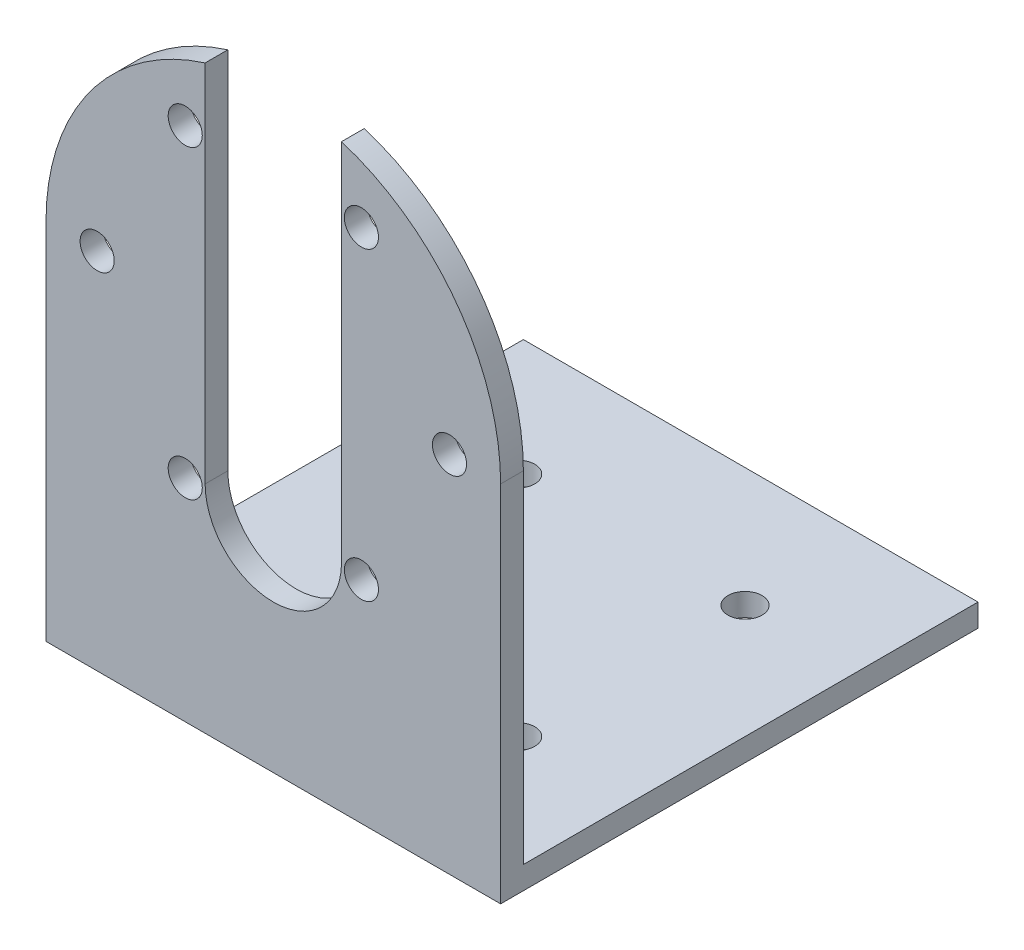
ISO-10303-21;
HEADER;
FILE_DESCRIPTION(('STEP AP214'),'2;1');
FILE_NAME('part.step','',(''),(''),'','','');
FILE_SCHEMA(('AUTOMOTIVE_DESIGN { 1 0 10303 214 1 1 1 1 }'));
ENDSEC;
DATA;
#1=APPLICATION_CONTEXT('core data for automotive mechanical design processes');
#2=APPLICATION_PROTOCOL_DEFINITION('international standard','automotive_design',2000,#1);
#3=PRODUCT_CONTEXT('',#1,'mechanical');
#4=PRODUCT('Part','Part','',(#3));
#5=PRODUCT_RELATED_PRODUCT_CATEGORY('part','',(#4));
#6=PRODUCT_DEFINITION_FORMATION('','',#4);
#7=PRODUCT_DEFINITION_CONTEXT('part definition',#1,'design');
#8=PRODUCT_DEFINITION('design','',#6,#7);
#9=PRODUCT_DEFINITION_SHAPE('','',#8);
#10=(LENGTH_UNIT() NAMED_UNIT(*) SI_UNIT(.MILLI.,.METRE.));
#11=(NAMED_UNIT(*) PLANE_ANGLE_UNIT() SI_UNIT($,.RADIAN.));
#12=(NAMED_UNIT(*) SI_UNIT($,.STERADIAN.) SOLID_ANGLE_UNIT());
#13=UNCERTAINTY_MEASURE_WITH_UNIT(LENGTH_MEASURE(1.E-05),#10,'distance_accuracy_value','');
#14=(GEOMETRIC_REPRESENTATION_CONTEXT(3) GLOBAL_UNCERTAINTY_ASSIGNED_CONTEXT((#13)) GLOBAL_UNIT_ASSIGNED_CONTEXT((#10,
#11,#12)) REPRESENTATION_CONTEXT('',''));
#15=CARTESIAN_POINT('',(0.,0.,0.));
#16=DIRECTION('',(0.,0.,1.));
#17=DIRECTION('',(1.,0.,0.));
#18=AXIS2_PLACEMENT_3D('',#15,#16,#17);
#19=CARTESIAN_POINT('',(0.,2.,0.));
#20=DIRECTION('',(0.,1.,0.));
#21=DIRECTION('',(0.,0.,1.));
#22=AXIS2_PLACEMENT_3D('',#19,#20,#21);
#23=PLANE('',#22);
#24=CARTESIAN_POINT('',(10.,2.,9.5));
#25=DIRECTION('',(0.,1.,0.));
#26=DIRECTION('',(0.,0.,1.));
#27=AXIS2_PLACEMENT_3D('',#24,#25,#26);
#28=CIRCLE('',#27,1.5);
#29=CARTESIAN_POINT('',(10.,2.,11.));
#30=VERTEX_POINT('',#29);
#31=EDGE_CURVE('E581',#30,#30,#28,.F.);
#32=ORIENTED_EDGE('',*,*,#31,.T.);
#33=EDGE_LOOP('',(#32));
#34=FACE_BOUND('',#33,.T.);
#35=CARTESIAN_POINT('',(-10.,2.,9.5));
#36=DIRECTION('',(0.,1.,0.));
#37=DIRECTION('',(0.,0.,1.));
#38=AXIS2_PLACEMENT_3D('',#35,#36,#37);
#39=CIRCLE('',#38,1.49999999999999);
#40=CARTESIAN_POINT('',(-10.,2.,11.));
#41=VERTEX_POINT('',#40);
#42=EDGE_CURVE('E578',#41,#41,#39,.F.);
#43=ORIENTED_EDGE('',*,*,#42,.T.);
#44=EDGE_LOOP('',(#43));
#45=FACE_BOUND('',#44,.T.);
#46=DIRECTION('',(-1.,0.,0.));
#47=VECTOR('',#46,1.);
#48=CARTESIAN_POINT('',(-20.,2.,19.));
#49=LINE('',#48,#47);
#50=CARTESIAN_POINT('',(20.,2.,19.));
#51=VERTEX_POINT('',#50);
#52=CARTESIAN_POINT('',(-20.,2.,19.));
#53=VERTEX_POINT('',#52);
#54=EDGE_CURVE('E196',#51,#53,#49,.T.);
#55=ORIENTED_EDGE('',*,*,#54,.F.);
#56=DIRECTION('',(0.,0.,-1.));
#57=VECTOR('',#56,1.);
#58=CARTESIAN_POINT('',(20.,2.,-21.));
#59=LINE('',#58,#57);
#60=CARTESIAN_POINT('',(20.,2.,-21.));
#61=VERTEX_POINT('',#60);
#62=EDGE_CURVE('E202',#51,#61,#59,.T.);
#63=ORIENTED_EDGE('',*,*,#62,.T.);
#64=DIRECTION('',(-1.,0.,0.));
#65=VECTOR('',#64,1.);
#66=CARTESIAN_POINT('',(-20.,2.,-21.));
#67=LINE('',#66,#65);
#68=CARTESIAN_POINT('',(-20.,2.,-21.));
#69=VERTEX_POINT('',#68);
#70=EDGE_CURVE('E204',#61,#69,#67,.T.);
#71=ORIENTED_EDGE('',*,*,#70,.T.);
#72=DIRECTION('',(0.,0.,1.));
#73=VECTOR('',#72,1.);
#74=CARTESIAN_POINT('',(-20.,2.,-21.));
#75=LINE('',#74,#73);
#76=EDGE_CURVE('E207',#69,#53,#75,.T.);
#77=ORIENTED_EDGE('',*,*,#76,.T.);
#78=EDGE_LOOP('',(#55,#63,#71,#77));
#79=FACE_BOUND('',#78,.T.);
#80=CARTESIAN_POINT('',(10.,2.,-10.5));
#81=DIRECTION('',(0.,1.,0.));
#82=DIRECTION('',(0.,0.,1.));
#83=AXIS2_PLACEMENT_3D('',#80,#81,#82);
#84=CIRCLE('',#83,1.5);
#85=CARTESIAN_POINT('',(10.,2.,-9.));
#86=VERTEX_POINT('',#85);
#87=EDGE_CURVE('E583',#86,#86,#84,.T.);
#88=ORIENTED_EDGE('',*,*,#87,.F.);
#89=EDGE_LOOP('',(#88));
#90=FACE_BOUND('',#89,.T.);
#91=CARTESIAN_POINT('',(-10.,2.,-10.5));
#92=DIRECTION('',(0.,1.,0.));
#93=DIRECTION('',(0.,0.,1.));
#94=AXIS2_PLACEMENT_3D('',#91,#92,#93);
#95=CIRCLE('',#94,1.5);
#96=CARTESIAN_POINT('',(-10.,2.,-9.00000000000001));
#97=VERTEX_POINT('',#96);
#98=EDGE_CURVE('E149',#97,#97,#95,.T.);
#99=ORIENTED_EDGE('',*,*,#98,.F.);
#100=EDGE_LOOP('',(#99));
#101=FACE_BOUND('',#100,.T.);
#102=ADVANCED_FACE('F55',(#34,#45,#79,#90,#101),#23,.T.);
#103=CARTESIAN_POINT('',(0.,0.,0.));
#104=DIRECTION('',(0.,1.,0.));
#105=DIRECTION('',(0.,0.,1.));
#106=AXIS2_PLACEMENT_3D('',#103,#104,#105);
#107=PLANE('',#106);
#108=CARTESIAN_POINT('',(10.,0.,-10.5));
#109=DIRECTION('',(0.,-1.,0.));
#110=DIRECTION('',(0.,0.,-1.));
#111=AXIS2_PLACEMENT_3D('',#108,#109,#110);
#112=CIRCLE('',#111,1.5);
#113=CARTESIAN_POINT('',(10.,0.,-12.));
#114=VERTEX_POINT('',#113);
#115=EDGE_CURVE('E568',#114,#114,#112,.T.);
#116=ORIENTED_EDGE('',*,*,#115,.F.);
#117=EDGE_LOOP('',(#116));
#118=FACE_BOUND('',#117,.T.);
#119=CARTESIAN_POINT('',(10.,0.,9.5));
#120=DIRECTION('',(0.,-1.,0.));
#121=DIRECTION('',(0.,0.,-1.));
#122=AXIS2_PLACEMENT_3D('',#119,#120,#121);
#123=CIRCLE('',#122,1.5);
#124=CARTESIAN_POINT('',(10.,0.,8.));
#125=VERTEX_POINT('',#124);
#126=EDGE_CURVE('E571',#125,#125,#123,.F.);
#127=ORIENTED_EDGE('',*,*,#126,.T.);
#128=EDGE_LOOP('',(#127));
#129=FACE_BOUND('',#128,.T.);
#130=CARTESIAN_POINT('',(-10.,0.,9.5));
#131=DIRECTION('',(0.,-1.,0.));
#132=DIRECTION('',(0.,0.,-1.));
#133=AXIS2_PLACEMENT_3D('',#130,#131,#132);
#134=CIRCLE('',#133,1.49999999999999);
#135=CARTESIAN_POINT('',(-10.,0.,8.00000000000001));
#136=VERTEX_POINT('',#135);
#137=EDGE_CURVE('E575',#136,#136,#134,.F.);
#138=ORIENTED_EDGE('',*,*,#137,.T.);
#139=EDGE_LOOP('',(#138));
#140=FACE_BOUND('',#139,.T.);
#141=DIRECTION('',(0.,0.,-1.));
#142=VECTOR('',#141,1.);
#143=CARTESIAN_POINT('',(20.,0.,-21.));
#144=LINE('',#143,#142);
#145=CARTESIAN_POINT('',(20.,0.,21.));
#146=VERTEX_POINT('',#145);
#147=CARTESIAN_POINT('',(20.,0.,-21.));
#148=VERTEX_POINT('',#147);
#149=EDGE_CURVE('E201',#146,#148,#144,.T.);
#150=ORIENTED_EDGE('',*,*,#149,.F.);
#151=DIRECTION('',(1.,0.,0.));
#152=VECTOR('',#151,1.);
#153=CARTESIAN_POINT('',(-20.,0.,21.));
#154=LINE('',#153,#152);
#155=CARTESIAN_POINT('',(-20.,0.,21.));
#156=VERTEX_POINT('',#155);
#157=EDGE_CURVE('E205',#156,#146,#154,.T.);
#158=ORIENTED_EDGE('',*,*,#157,.F.);
#159=DIRECTION('',(0.,0.,1.));
#160=VECTOR('',#159,1.);
#161=CARTESIAN_POINT('',(-20.,0.,-21.));
#162=LINE('',#161,#160);
#163=CARTESIAN_POINT('',(-20.,0.,-21.));
#164=VERTEX_POINT('',#163);
#165=EDGE_CURVE('E215',#164,#156,#162,.T.);
#166=ORIENTED_EDGE('',*,*,#165,.F.);
#167=DIRECTION('',(-1.,0.,0.));
#168=VECTOR('',#167,1.);
#169=CARTESIAN_POINT('',(-20.,0.,-21.));
#170=LINE('',#169,#168);
#171=EDGE_CURVE('E213',#148,#164,#170,.T.);
#172=ORIENTED_EDGE('',*,*,#171,.F.);
#173=EDGE_LOOP('',(#150,#158,#166,#172));
#174=FACE_BOUND('',#173,.T.);
#175=CARTESIAN_POINT('',(-10.,0.,-10.5));
#176=DIRECTION('',(0.,-1.,0.));
#177=DIRECTION('',(0.,0.,-1.));
#178=AXIS2_PLACEMENT_3D('',#175,#176,#177);
#179=CIRCLE('',#178,1.5);
#180=CARTESIAN_POINT('',(-10.,0.,-12.));
#181=VERTEX_POINT('',#180);
#182=EDGE_CURVE('E567',#181,#181,#179,.T.);
#183=ORIENTED_EDGE('',*,*,#182,.F.);
#184=EDGE_LOOP('',(#183));
#185=FACE_BOUND('',#184,.T.);
#186=ADVANCED_FACE('F268',(#118,#129,#140,#174,#185),#107,.F.);
#187=CARTESIAN_POINT('',(-20.,2.,21.));
#188=DIRECTION('',(0.,0.,-1.));
#189=DIRECTION('',(-1.,0.,0.));
#190=AXIS2_PLACEMENT_3D('',#187,#188,#189);
#191=PLANE('',#190);
#192=CARTESIAN_POINT('',(-7.75000000000006,18.5766062413412,21.));
#193=DIRECTION('',(0.,0.,1.));
#194=DIRECTION('',(1.,0.,0.));
#195=AXIS2_PLACEMENT_3D('',#192,#193,#194);
#196=CIRCLE('',#195,1.5);
#197=CARTESIAN_POINT('',(-6.25000000000006,18.5766062413412,21.));
#198=VERTEX_POINT('',#197);
#199=EDGE_CURVE('E168',#198,#198,#196,.T.);
#200=ORIENTED_EDGE('',*,*,#199,.F.);
#201=EDGE_LOOP('',(#200));
#202=FACE_BOUND('',#201,.T.);
#203=CARTESIAN_POINT('',(-7.74999999999986,45.4233937586589,21.));
#204=DIRECTION('',(0.,0.,1.));
#205=DIRECTION('',(1.,0.,0.));
#206=AXIS2_PLACEMENT_3D('',#203,#204,#205);
#207=CIRCLE('',#206,1.5);
#208=CARTESIAN_POINT('',(-6.24999999999986,45.4233937586589,21.));
#209=VERTEX_POINT('',#208);
#210=EDGE_CURVE('E174',#209,#209,#207,.T.);
#211=ORIENTED_EDGE('',*,*,#210,.F.);
#212=EDGE_LOOP('',(#211));
#213=FACE_BOUND('',#212,.T.);
#214=CARTESIAN_POINT('',(7.75000000000016,45.4233937586587,21.));
#215=DIRECTION('',(0.,0.,1.));
#216=DIRECTION('',(1.,0.,0.));
#217=AXIS2_PLACEMENT_3D('',#214,#215,#216);
#218=CIRCLE('',#217,1.5);
#219=CARTESIAN_POINT('',(9.25000000000016,45.4233937586587,21.));
#220=VERTEX_POINT('',#219);
#221=EDGE_CURVE('E177',#220,#220,#218,.T.);
#222=ORIENTED_EDGE('',*,*,#221,.F.);
#223=EDGE_LOOP('',(#222));
#224=FACE_BOUND('',#223,.T.);
#225=CARTESIAN_POINT('',(15.5,32.,21.));
#226=DIRECTION('',(0.,0.,1.));
#227=DIRECTION('',(1.,0.,0.));
#228=AXIS2_PLACEMENT_3D('',#225,#226,#227);
#229=CIRCLE('',#228,1.5);
#230=CARTESIAN_POINT('',(17.,32.,21.));
#231=VERTEX_POINT('',#230);
#232=EDGE_CURVE('E171',#231,#231,#229,.T.);
#233=ORIENTED_EDGE('',*,*,#232,.F.);
#234=EDGE_LOOP('',(#233));
#235=FACE_BOUND('',#234,.T.);
#236=CARTESIAN_POINT('',(7.74999999999997,18.5766062413412,21.));
#237=DIRECTION('',(0.,0.,1.));
#238=DIRECTION('',(1.,0.,0.));
#239=AXIS2_PLACEMENT_3D('',#236,#237,#238);
#240=CIRCLE('',#239,1.5);
#241=CARTESIAN_POINT('',(9.24999999999997,18.5766062413412,21.));
#242=VERTEX_POINT('',#241);
#243=EDGE_CURVE('E163',#242,#242,#240,.T.);
#244=ORIENTED_EDGE('',*,*,#243,.F.);
#245=EDGE_LOOP('',(#244));
#246=FACE_BOUND('',#245,.T.);
#247=CARTESIAN_POINT('',(-15.5,32.,21.));
#248=DIRECTION('',(0.,0.,1.));
#249=DIRECTION('',(1.,0.,0.));
#250=AXIS2_PLACEMENT_3D('',#247,#248,#249);
#251=CIRCLE('',#250,1.5);
#252=CARTESIAN_POINT('',(-14.,32.,21.));
#253=VERTEX_POINT('',#252);
#254=EDGE_CURVE('E164',#253,#253,#251,.T.);
#255=ORIENTED_EDGE('',*,*,#254,.F.);
#256=EDGE_LOOP('',(#255));
#257=FACE_BOUND('',#256,.T.);
#258=DIRECTION('',(0.,1.,0.));
#259=VECTOR('',#258,1.);
#260=CARTESIAN_POINT('',(-6.,0.,21.));
#261=LINE('',#260,#259);
#262=CARTESIAN_POINT('',(-6.,19.,21.));
#263=VERTEX_POINT('',#262);
#264=CARTESIAN_POINT('',(-6.,51.0787840283389,21.));
#265=VERTEX_POINT('',#264);
#266=EDGE_CURVE('E144',#263,#265,#261,.T.);
#267=ORIENTED_EDGE('',*,*,#266,.T.);
#268=CARTESIAN_POINT('',(0.,32.,21.));
#269=DIRECTION('',(0.,0.,1.));
#270=DIRECTION('',(1.,0.,0.));
#271=AXIS2_PLACEMENT_3D('',#268,#269,#270);
#272=CIRCLE('',#271,20.);
#273=CARTESIAN_POINT('',(-20.,32.,21.));
#274=VERTEX_POINT('',#273);
#275=EDGE_CURVE('E185',#265,#274,#272,.T.);
#276=ORIENTED_EDGE('',*,*,#275,.T.);
#277=DIRECTION('',(0.,-1.,0.));
#278=VECTOR('',#277,1.);
#279=CARTESIAN_POINT('',(-20.,2.,21.));
#280=LINE('',#279,#278);
#281=EDGE_CURVE('E221',#274,#156,#280,.T.);
#282=ORIENTED_EDGE('',*,*,#281,.T.);
#283=ORIENTED_EDGE('',*,*,#157,.T.);
#284=DIRECTION('',(0.,-1.,0.));
#285=VECTOR('',#284,1.);
#286=CARTESIAN_POINT('',(20.,2.,21.));
#287=LINE('',#286,#285);
#288=CARTESIAN_POINT('',(20.,32.,21.));
#289=VERTEX_POINT('',#288);
#290=EDGE_CURVE('E210',#289,#146,#287,.T.);
#291=ORIENTED_EDGE('',*,*,#290,.F.);
#292=CARTESIAN_POINT('',(6.00000000000001,51.0787840283389,21.));
#293=VERTEX_POINT('',#292);
#294=EDGE_CURVE('E187',#289,#293,#272,.T.);
#295=ORIENTED_EDGE('',*,*,#294,.T.);
#296=DIRECTION('',(0.,1.,0.));
#297=VECTOR('',#296,1.);
#298=CARTESIAN_POINT('',(6.00000000000001,0.,21.));
#299=LINE('',#298,#297);
#300=CARTESIAN_POINT('',(6.00000000000001,19.,21.));
#301=VERTEX_POINT('',#300);
#302=EDGE_CURVE('E70',#301,#293,#299,.T.);
#303=ORIENTED_EDGE('',*,*,#302,.F.);
#304=CARTESIAN_POINT('',(0.,19.,21.));
#305=DIRECTION('',(0.,0.,1.));
#306=DIRECTION('',(1.,0.,0.));
#307=AXIS2_PLACEMENT_3D('',#304,#305,#306);
#308=CIRCLE('',#307,6.);
#309=EDGE_CURVE('E138',#263,#301,#308,.T.);
#310=ORIENTED_EDGE('',*,*,#309,.F.);
#311=EDGE_LOOP('',(#267,#276,#282,#283,#291,#295,#303,#310));
#312=FACE_BOUND('',#311,.T.);
#313=ADVANCED_FACE('F151',(#202,#213,#224,#235,#246,#257,#312),#191,.F.);
#314=CARTESIAN_POINT('',(-20.,52.,19.));
#315=DIRECTION('',(0.,0.,1.));
#316=DIRECTION('',(1.,0.,0.));
#317=AXIS2_PLACEMENT_3D('',#314,#315,#316);
#318=PLANE('',#317);
#319=CARTESIAN_POINT('',(-7.75000000000006,18.5766062413412,19.));
#320=DIRECTION('',(0.,0.,1.));
#321=DIRECTION('',(1.,0.,0.));
#322=AXIS2_PLACEMENT_3D('',#319,#320,#321);
#323=CIRCLE('',#322,1.5);
#324=CARTESIAN_POINT('',(-6.25000000000006,18.5766062413412,19.));
#325=VERTEX_POINT('',#324);
#326=EDGE_CURVE('E167',#325,#325,#323,.T.);
#327=ORIENTED_EDGE('',*,*,#326,.T.);
#328=EDGE_LOOP('',(#327));
#329=FACE_BOUND('',#328,.T.);
#330=CARTESIAN_POINT('',(-7.74999999999986,45.4233937586589,19.));
#331=DIRECTION('',(0.,0.,1.));
#332=DIRECTION('',(1.,0.,0.));
#333=AXIS2_PLACEMENT_3D('',#330,#331,#332);
#334=CIRCLE('',#333,1.5);
#335=CARTESIAN_POINT('',(-6.24999999999986,45.4233937586589,19.));
#336=VERTEX_POINT('',#335);
#337=EDGE_CURVE('E232',#336,#336,#334,.T.);
#338=ORIENTED_EDGE('',*,*,#337,.T.);
#339=EDGE_LOOP('',(#338));
#340=FACE_BOUND('',#339,.T.);
#341=CARTESIAN_POINT('',(7.75000000000016,45.4233937586587,19.));
#342=DIRECTION('',(0.,0.,1.));
#343=DIRECTION('',(1.,0.,0.));
#344=AXIS2_PLACEMENT_3D('',#341,#342,#343);
#345=CIRCLE('',#344,1.5);
#346=CARTESIAN_POINT('',(9.25000000000016,45.4233937586587,19.));
#347=VERTEX_POINT('',#346);
#348=EDGE_CURVE('E235',#347,#347,#345,.T.);
#349=ORIENTED_EDGE('',*,*,#348,.T.);
#350=EDGE_LOOP('',(#349));
#351=FACE_BOUND('',#350,.T.);
#352=CARTESIAN_POINT('',(15.5,32.,19.));
#353=DIRECTION('',(0.,0.,1.));
#354=DIRECTION('',(1.,0.,0.));
#355=AXIS2_PLACEMENT_3D('',#352,#353,#354);
#356=CIRCLE('',#355,1.5);
#357=CARTESIAN_POINT('',(17.,32.,19.));
#358=VERTEX_POINT('',#357);
#359=EDGE_CURVE('E238',#358,#358,#356,.T.);
#360=ORIENTED_EDGE('',*,*,#359,.T.);
#361=EDGE_LOOP('',(#360));
#362=FACE_BOUND('',#361,.T.);
#363=CARTESIAN_POINT('',(7.74999999999997,18.5766062413412,19.));
#364=DIRECTION('',(0.,0.,1.));
#365=DIRECTION('',(1.,0.,0.));
#366=AXIS2_PLACEMENT_3D('',#363,#364,#365);
#367=CIRCLE('',#366,1.5);
#368=CARTESIAN_POINT('',(9.24999999999997,18.5766062413412,19.));
#369=VERTEX_POINT('',#368);
#370=EDGE_CURVE('E241',#369,#369,#367,.T.);
#371=ORIENTED_EDGE('',*,*,#370,.T.);
#372=EDGE_LOOP('',(#371));
#373=FACE_BOUND('',#372,.T.);
#374=CARTESIAN_POINT('',(-15.5,32.,19.));
#375=DIRECTION('',(0.,0.,1.));
#376=DIRECTION('',(1.,0.,0.));
#377=AXIS2_PLACEMENT_3D('',#374,#375,#376);
#378=CIRCLE('',#377,1.5);
#379=CARTESIAN_POINT('',(-14.,32.,19.));
#380=VERTEX_POINT('',#379);
#381=EDGE_CURVE('E186',#380,#380,#378,.T.);
#382=ORIENTED_EDGE('',*,*,#381,.T.);
#383=EDGE_LOOP('',(#382));
#384=FACE_BOUND('',#383,.T.);
#385=DIRECTION('',(0.,1.,0.));
#386=VECTOR('',#385,1.);
#387=CARTESIAN_POINT('',(-6.,52.,19.));
#388=LINE('',#387,#386);
#389=CARTESIAN_POINT('',(-6.,19.,18.9999999999999));
#390=VERTEX_POINT('',#389);
#391=CARTESIAN_POINT('',(-6.,51.0787840283389,18.9999999999999));
#392=VERTEX_POINT('',#391);
#393=EDGE_CURVE('E161',#390,#392,#388,.T.);
#394=ORIENTED_EDGE('',*,*,#393,.F.);
#395=CARTESIAN_POINT('',(0.,19.,18.9999999999999));
#396=DIRECTION('',(0.,0.,1.));
#397=DIRECTION('',(1.,0.,0.));
#398=AXIS2_PLACEMENT_3D('',#395,#396,#397);
#399=CIRCLE('',#398,6.);
#400=CARTESIAN_POINT('',(6.00000000000001,19.,18.9999999999999));
#401=VERTEX_POINT('',#400);
#402=EDGE_CURVE('E12',#390,#401,#399,.T.);
#403=ORIENTED_EDGE('',*,*,#402,.T.);
#404=DIRECTION('',(0.,1.,0.));
#405=VECTOR('',#404,1.);
#406=CARTESIAN_POINT('',(6.00000000000001,52.,19.));
#407=LINE('',#406,#405);
#408=CARTESIAN_POINT('',(6.00000000000001,51.0787840283389,18.9999999999999));
#409=VERTEX_POINT('',#408);
#410=EDGE_CURVE('E157',#401,#409,#407,.T.);
#411=ORIENTED_EDGE('',*,*,#410,.T.);
#412=CARTESIAN_POINT('',(0.,32.,19.));
#413=DIRECTION('',(0.,0.,1.));
#414=DIRECTION('',(1.,0.,0.));
#415=AXIS2_PLACEMENT_3D('',#412,#413,#414);
#416=CIRCLE('',#415,20.);
#417=CARTESIAN_POINT('',(20.,32.,19.));
#418=VERTEX_POINT('',#417);
#419=EDGE_CURVE('E193',#418,#409,#416,.T.);
#420=ORIENTED_EDGE('',*,*,#419,.F.);
#421=DIRECTION('',(0.,-1.,0.));
#422=VECTOR('',#421,1.);
#423=CARTESIAN_POINT('',(20.,52.,19.));
#424=LINE('',#423,#422);
#425=EDGE_CURVE('E78',#418,#51,#424,.T.);
#426=ORIENTED_EDGE('',*,*,#425,.T.);
#427=ORIENTED_EDGE('',*,*,#54,.T.);
#428=DIRECTION('',(0.,-1.,0.));
#429=VECTOR('',#428,1.);
#430=CARTESIAN_POINT('',(-20.,52.,19.));
#431=LINE('',#430,#429);
#432=CARTESIAN_POINT('',(-20.,32.,19.));
#433=VERTEX_POINT('',#432);
#434=EDGE_CURVE('E198',#433,#53,#431,.T.);
#435=ORIENTED_EDGE('',*,*,#434,.F.);
#436=EDGE_CURVE('E192',#392,#433,#416,.T.);
#437=ORIENTED_EDGE('',*,*,#436,.F.);
#438=EDGE_LOOP('',(#394,#403,#411,#420,#426,#427,#435,#437));
#439=FACE_BOUND('',#438,.T.);
#440=ADVANCED_FACE('F251',(#329,#340,#351,#362,#373,#384,#439),#318,.F.);
#441=CARTESIAN_POINT('',(0.,32.,-29.));
#442=DIRECTION('',(0.,0.,1.));
#443=DIRECTION('',(1.,0.,0.));
#444=AXIS2_PLACEMENT_3D('',#441,#442,#443);
#445=CYLINDRICAL_SURFACE('',#444,20.);
#446=ORIENTED_EDGE('',*,*,#275,.F.);
#447=DIRECTION('',(0.,0.,1.));
#448=VECTOR('',#447,1.);
#449=CARTESIAN_POINT('',(-6.,51.0787840283389,-29.));
#450=LINE('',#449,#448);
#451=EDGE_CURVE('E63',#265,#392,#450,.F.);
#452=ORIENTED_EDGE('',*,*,#451,.T.);
#453=ORIENTED_EDGE('',*,*,#436,.T.);
#454=DIRECTION('',(0.,0.,1.));
#455=VECTOR('',#454,1.);
#456=CARTESIAN_POINT('',(-20.,32.,-29.));
#457=LINE('',#456,#455);
#458=EDGE_CURVE('E189',#433,#274,#457,.T.);
#459=ORIENTED_EDGE('',*,*,#458,.T.);
#460=EDGE_LOOP('',(#446,#452,#453,#459));
#461=FACE_BOUND('',#460,.T.);
#462=ADVANCED_FACE('F248',(#461),#445,.T.);
#463=CARTESIAN_POINT('',(-20.,2.,-21.));
#464=DIRECTION('',(1.,0.,0.));
#465=DIRECTION('',(0.,0.,-1.));
#466=AXIS2_PLACEMENT_3D('',#463,#464,#465);
#467=PLANE('',#466);
#468=ORIENTED_EDGE('',*,*,#458,.F.);
#469=ORIENTED_EDGE('',*,*,#434,.T.);
#470=ORIENTED_EDGE('',*,*,#76,.F.);
#471=DIRECTION('',(0.,-1.,0.));
#472=VECTOR('',#471,1.);
#473=CARTESIAN_POINT('',(-20.,2.,-21.));
#474=LINE('',#473,#472);
#475=EDGE_CURVE('E223',#69,#164,#474,.T.);
#476=ORIENTED_EDGE('',*,*,#475,.T.);
#477=ORIENTED_EDGE('',*,*,#165,.T.);
#478=ORIENTED_EDGE('',*,*,#281,.F.);
#479=EDGE_LOOP('',(#468,#469,#470,#476,#477,#478));
#480=FACE_BOUND('',#479,.T.);
#481=ADVANCED_FACE('F254',(#480),#467,.F.);
#482=CARTESIAN_POINT('',(20.,2.,-21.));
#483=DIRECTION('',(-1.,0.,0.));
#484=DIRECTION('',(0.,0.,1.));
#485=AXIS2_PLACEMENT_3D('',#482,#483,#484);
#486=PLANE('',#485);
#487=ORIENTED_EDGE('',*,*,#425,.F.);
#488=DIRECTION('',(0.,0.,1.));
#489=VECTOR('',#488,1.);
#490=CARTESIAN_POINT('',(20.,32.,-29.));
#491=LINE('',#490,#489);
#492=EDGE_CURVE('E182',#418,#289,#491,.T.);
#493=ORIENTED_EDGE('',*,*,#492,.T.);
#494=ORIENTED_EDGE('',*,*,#290,.T.);
#495=ORIENTED_EDGE('',*,*,#149,.T.);
#496=DIRECTION('',(0.,-1.,0.));
#497=VECTOR('',#496,1.);
#498=CARTESIAN_POINT('',(20.,2.,-21.));
#499=LINE('',#498,#497);
#500=EDGE_CURVE('E226',#61,#148,#499,.T.);
#501=ORIENTED_EDGE('',*,*,#500,.F.);
#502=ORIENTED_EDGE('',*,*,#62,.F.);
#503=EDGE_LOOP('',(#487,#493,#494,#495,#501,#502));
#504=FACE_BOUND('',#503,.T.);
#505=ADVANCED_FACE('F57',(#504),#486,.F.);
#506=CARTESIAN_POINT('',(-20.,2.,-21.));
#507=DIRECTION('',(0.,0.,1.));
#508=DIRECTION('',(1.,0.,0.));
#509=AXIS2_PLACEMENT_3D('',#506,#507,#508);
#510=PLANE('',#509);
#511=ORIENTED_EDGE('',*,*,#171,.T.);
#512=ORIENTED_EDGE('',*,*,#475,.F.);
#513=ORIENTED_EDGE('',*,*,#70,.F.);
#514=ORIENTED_EDGE('',*,*,#500,.T.);
#515=EDGE_LOOP('',(#511,#512,#513,#514));
#516=FACE_BOUND('',#515,.T.);
#517=ADVANCED_FACE('F263',(#516),#510,.F.);
#518=DIRECTION('',(0.,0.,1.));
#519=VECTOR('',#518,1.);
#520=CARTESIAN_POINT('',(6.00000000000001,51.0787840283389,-29.));
#521=LINE('',#520,#519);
#522=EDGE_CURVE('E229',#293,#409,#521,.F.);
#523=ORIENTED_EDGE('',*,*,#522,.F.);
#524=ORIENTED_EDGE('',*,*,#294,.F.);
#525=ORIENTED_EDGE('',*,*,#492,.F.);
#526=ORIENTED_EDGE('',*,*,#419,.T.);
#527=EDGE_LOOP('',(#523,#524,#525,#526));
#528=FACE_BOUND('',#527,.T.);
#529=ADVANCED_FACE('F274',(#528),#445,.T.);
#530=CARTESIAN_POINT('',(-7.75000000000006,18.5766062413412,-29.));
#531=DIRECTION('',(0.,0.,1.));
#532=DIRECTION('',(1.,0.,0.));
#533=AXIS2_PLACEMENT_3D('',#530,#531,#532);
#534=CYLINDRICAL_SURFACE('',#533,1.5);
#535=ORIENTED_EDGE('',*,*,#199,.T.);
#536=EDGE_LOOP('',(#535));
#537=FACE_BOUND('',#536,.T.);
#538=ORIENTED_EDGE('',*,*,#326,.F.);
#539=EDGE_LOOP('',(#538));
#540=FACE_BOUND('',#539,.T.);
#541=ADVANCED_FACE('F310',(#537,#540),#534,.F.);
#542=CARTESIAN_POINT('',(-7.74999999999986,45.4233937586589,-29.));
#543=DIRECTION('',(0.,0.,1.));
#544=DIRECTION('',(1.,0.,0.));
#545=AXIS2_PLACEMENT_3D('',#542,#543,#544);
#546=CYLINDRICAL_SURFACE('',#545,1.5);
#547=ORIENTED_EDGE('',*,*,#210,.T.);
#548=EDGE_LOOP('',(#547));
#549=FACE_BOUND('',#548,.T.);
#550=ORIENTED_EDGE('',*,*,#337,.F.);
#551=EDGE_LOOP('',(#550));
#552=FACE_BOUND('',#551,.T.);
#553=ADVANCED_FACE('F461',(#549,#552),#546,.F.);
#554=CARTESIAN_POINT('',(7.75000000000016,45.4233937586587,-29.));
#555=DIRECTION('',(0.,0.,1.));
#556=DIRECTION('',(1.,0.,0.));
#557=AXIS2_PLACEMENT_3D('',#554,#555,#556);
#558=CYLINDRICAL_SURFACE('',#557,1.5);
#559=ORIENTED_EDGE('',*,*,#221,.T.);
#560=EDGE_LOOP('',(#559));
#561=FACE_BOUND('',#560,.T.);
#562=ORIENTED_EDGE('',*,*,#348,.F.);
#563=EDGE_LOOP('',(#562));
#564=FACE_BOUND('',#563,.T.);
#565=ADVANCED_FACE('F451',(#561,#564),#558,.F.);
#566=CARTESIAN_POINT('',(15.5,32.,-29.));
#567=DIRECTION('',(0.,0.,1.));
#568=DIRECTION('',(1.,0.,0.));
#569=AXIS2_PLACEMENT_3D('',#566,#567,#568);
#570=CYLINDRICAL_SURFACE('',#569,1.5);
#571=ORIENTED_EDGE('',*,*,#232,.T.);
#572=EDGE_LOOP('',(#571));
#573=FACE_BOUND('',#572,.T.);
#574=ORIENTED_EDGE('',*,*,#359,.F.);
#575=EDGE_LOOP('',(#574));
#576=FACE_BOUND('',#575,.T.);
#577=ADVANCED_FACE('F441',(#573,#576),#570,.F.);
#578=CARTESIAN_POINT('',(7.74999999999997,18.5766062413412,-29.));
#579=DIRECTION('',(0.,0.,1.));
#580=DIRECTION('',(1.,0.,0.));
#581=AXIS2_PLACEMENT_3D('',#578,#579,#580);
#582=CYLINDRICAL_SURFACE('',#581,1.5);
#583=ORIENTED_EDGE('',*,*,#243,.T.);
#584=EDGE_LOOP('',(#583));
#585=FACE_BOUND('',#584,.T.);
#586=ORIENTED_EDGE('',*,*,#370,.F.);
#587=EDGE_LOOP('',(#586));
#588=FACE_BOUND('',#587,.T.);
#589=ADVANCED_FACE('F432',(#585,#588),#582,.F.);
#590=CARTESIAN_POINT('',(-15.5,32.,-29.));
#591=DIRECTION('',(0.,0.,1.));
#592=DIRECTION('',(1.,0.,0.));
#593=AXIS2_PLACEMENT_3D('',#590,#591,#592);
#594=CYLINDRICAL_SURFACE('',#593,1.5);
#595=ORIENTED_EDGE('',*,*,#254,.T.);
#596=EDGE_LOOP('',(#595));
#597=FACE_BOUND('',#596,.T.);
#598=ORIENTED_EDGE('',*,*,#381,.F.);
#599=EDGE_LOOP('',(#598));
#600=FACE_BOUND('',#599,.T.);
#601=ADVANCED_FACE('F409',(#597,#600),#594,.F.);
#602=CARTESIAN_POINT('',(0.,19.,-1012.));
#603=DIRECTION('',(0.,0.,1.));
#604=DIRECTION('',(1.,0.,0.));
#605=AXIS2_PLACEMENT_3D('',#602,#603,#604);
#606=CYLINDRICAL_SURFACE('',#605,6.);
#607=DIRECTION('',(0.,0.,1.));
#608=VECTOR('',#607,1.);
#609=CARTESIAN_POINT('',(-6.,19.,-1012.));
#610=LINE('',#609,#608);
#611=EDGE_CURVE('E133',#390,#263,#610,.T.);
#612=ORIENTED_EDGE('',*,*,#611,.T.);
#613=ORIENTED_EDGE('',*,*,#309,.T.);
#614=DIRECTION('',(0.,0.,1.));
#615=VECTOR('',#614,1.);
#616=CARTESIAN_POINT('',(6.00000000000001,19.,-1012.));
#617=LINE('',#616,#615);
#618=EDGE_CURVE('E141',#401,#301,#617,.T.);
#619=ORIENTED_EDGE('',*,*,#618,.F.);
#620=ORIENTED_EDGE('',*,*,#402,.F.);
#621=EDGE_LOOP('',(#612,#613,#619,#620));
#622=FACE_BOUND('',#621,.T.);
#623=ADVANCED_FACE('F135',(#622),#606,.F.);
#624=CARTESIAN_POINT('',(-6.,0.,-1012.));
#625=DIRECTION('',(1.,0.,0.));
#626=DIRECTION('',(0.,0.,-1.));
#627=AXIS2_PLACEMENT_3D('',#624,#625,#626);
#628=PLANE('',#627);
#629=ORIENTED_EDGE('',*,*,#393,.T.);
#630=ORIENTED_EDGE('',*,*,#451,.F.);
#631=ORIENTED_EDGE('',*,*,#266,.F.);
#632=ORIENTED_EDGE('',*,*,#611,.F.);
#633=EDGE_LOOP('',(#629,#630,#631,#632));
#634=FACE_BOUND('',#633,.T.);
#635=ADVANCED_FACE('F145',(#634),#628,.T.);
#636=CARTESIAN_POINT('',(6.00000000000001,0.,-1012.));
#637=DIRECTION('',(1.,0.,0.));
#638=DIRECTION('',(0.,0.,-1.));
#639=AXIS2_PLACEMENT_3D('',#636,#637,#638);
#640=PLANE('',#639);
#641=ORIENTED_EDGE('',*,*,#618,.T.);
#642=ORIENTED_EDGE('',*,*,#302,.T.);
#643=ORIENTED_EDGE('',*,*,#522,.T.);
#644=ORIENTED_EDGE('',*,*,#410,.F.);
#645=EDGE_LOOP('',(#641,#642,#643,#644));
#646=FACE_BOUND('',#645,.T.);
#647=ADVANCED_FACE('F275',(#646),#640,.F.);
#648=CARTESIAN_POINT('',(-10.,1033.,9.5));
#649=DIRECTION('',(0.,-1.,0.));
#650=DIRECTION('',(0.,0.,-1.));
#651=AXIS2_PLACEMENT_3D('',#648,#649,#650);
#652=CYLINDRICAL_SURFACE('',#651,1.49999999999999);
#653=ORIENTED_EDGE('',*,*,#42,.F.);
#654=EDGE_LOOP('',(#653));
#655=FACE_BOUND('',#654,.T.);
#656=ORIENTED_EDGE('',*,*,#137,.F.);
#657=EDGE_LOOP('',(#656));
#658=FACE_BOUND('',#657,.T.);
#659=ADVANCED_FACE('F277',(#655,#658),#652,.F.);
#660=CARTESIAN_POINT('',(10.,1033.,9.5));
#661=DIRECTION('',(0.,-1.,0.));
#662=DIRECTION('',(0.,0.,-1.));
#663=AXIS2_PLACEMENT_3D('',#660,#661,#662);
#664=CYLINDRICAL_SURFACE('',#663,1.5);
#665=ORIENTED_EDGE('',*,*,#31,.F.);
#666=EDGE_LOOP('',(#665));
#667=FACE_BOUND('',#666,.T.);
#668=ORIENTED_EDGE('',*,*,#126,.F.);
#669=EDGE_LOOP('',(#668));
#670=FACE_BOUND('',#669,.T.);
#671=ADVANCED_FACE('F283',(#667,#670),#664,.F.);
#672=CARTESIAN_POINT('',(10.,1033.,-10.5));
#673=DIRECTION('',(0.,-1.,0.));
#674=DIRECTION('',(0.,0.,-1.));
#675=AXIS2_PLACEMENT_3D('',#672,#673,#674);
#676=CYLINDRICAL_SURFACE('',#675,1.5);
#677=ORIENTED_EDGE('',*,*,#87,.T.);
#678=EDGE_LOOP('',(#677));
#679=FACE_BOUND('',#678,.T.);
#680=ORIENTED_EDGE('',*,*,#115,.T.);
#681=EDGE_LOOP('',(#680));
#682=FACE_BOUND('',#681,.T.);
#683=ADVANCED_FACE('F359',(#679,#682),#676,.F.);
#684=CARTESIAN_POINT('',(-10.,1033.,-10.5));
#685=DIRECTION('',(0.,-1.,0.));
#686=DIRECTION('',(0.,0.,-1.));
#687=AXIS2_PLACEMENT_3D('',#684,#685,#686);
#688=CYLINDRICAL_SURFACE('',#687,1.5);
#689=ORIENTED_EDGE('',*,*,#98,.T.);
#690=EDGE_LOOP('',(#689));
#691=FACE_BOUND('',#690,.T.);
#692=ORIENTED_EDGE('',*,*,#182,.T.);
#693=EDGE_LOOP('',(#692));
#694=FACE_BOUND('',#693,.T.);
#695=ADVANCED_FACE('F370',(#691,#694),#688,.F.);
#696=CLOSED_SHELL('',(#102,#186,#313,#440,#462,#481,#505,#517,#529,#541,#553,#565,#577,#589,
#601,#623,#635,#647,#659,#671,#683,#695));
#697=MANIFOLD_SOLID_BREP('B2',#696);
#698=ADVANCED_BREP_SHAPE_REPRESENTATION('',(#18,#697),#14);
#699=SHAPE_DEFINITION_REPRESENTATION(#9,#698);
ENDSEC;
END-ISO-10303-21;
